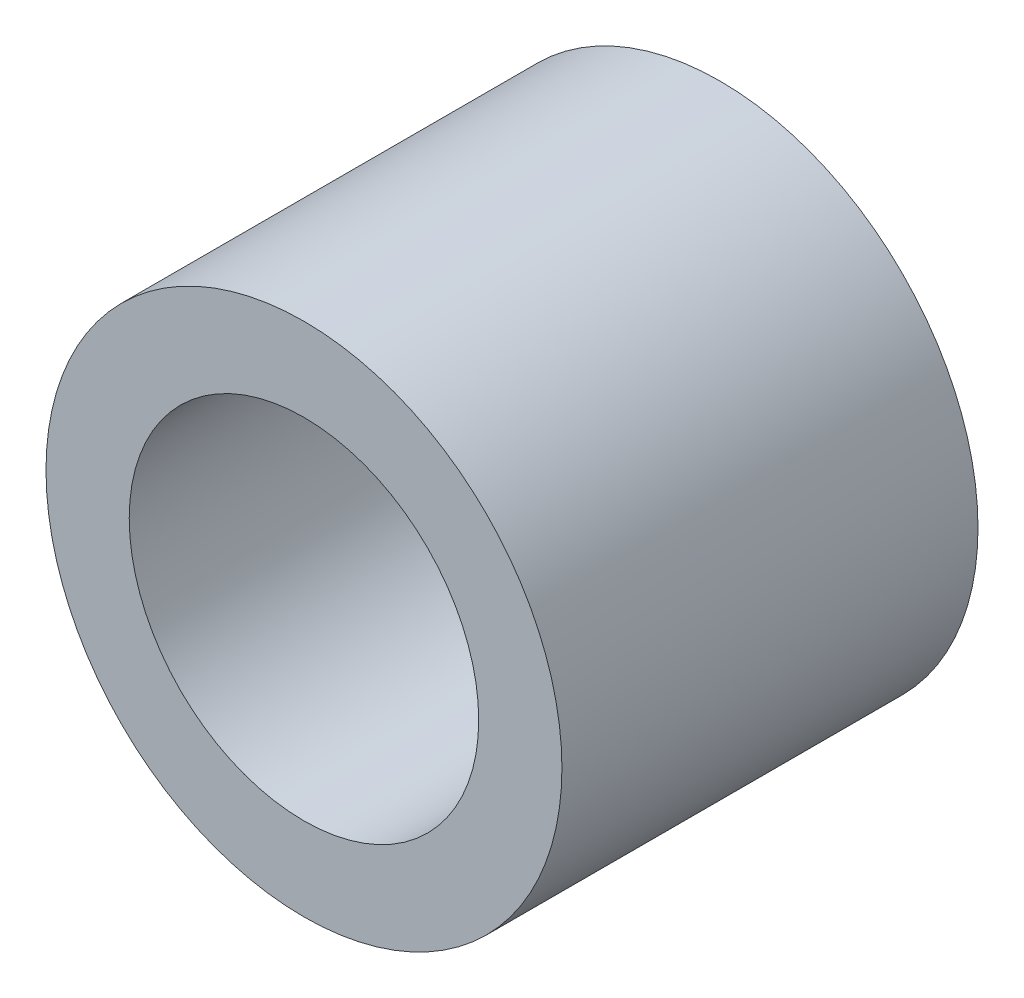
ISO-10303-21;
HEADER;
FILE_DESCRIPTION(('STEP AP214'),'2;1');
FILE_NAME('part.step','',(''),(''),'','','');
FILE_SCHEMA(('AUTOMOTIVE_DESIGN { 1 0 10303 214 1 1 1 1 }'));
ENDSEC;
DATA;
#1=APPLICATION_CONTEXT('core data for automotive mechanical design processes');
#2=APPLICATION_PROTOCOL_DEFINITION('international standard','automotive_design',2000,#1);
#3=PRODUCT_CONTEXT('',#1,'mechanical');
#4=PRODUCT('Part','Part','',(#3));
#5=PRODUCT_RELATED_PRODUCT_CATEGORY('part','',(#4));
#6=PRODUCT_DEFINITION_FORMATION('','',#4);
#7=PRODUCT_DEFINITION_CONTEXT('part definition',#1,'design');
#8=PRODUCT_DEFINITION('design','',#6,#7);
#9=PRODUCT_DEFINITION_SHAPE('','',#8);
#10=(LENGTH_UNIT() NAMED_UNIT(*) SI_UNIT(.MILLI.,.METRE.));
#11=(NAMED_UNIT(*) PLANE_ANGLE_UNIT() SI_UNIT($,.RADIAN.));
#12=(NAMED_UNIT(*) SI_UNIT($,.STERADIAN.) SOLID_ANGLE_UNIT());
#13=UNCERTAINTY_MEASURE_WITH_UNIT(LENGTH_MEASURE(1.E-05),#10,'distance_accuracy_value','');
#14=(GEOMETRIC_REPRESENTATION_CONTEXT(3) GLOBAL_UNCERTAINTY_ASSIGNED_CONTEXT((#13)) GLOBAL_UNIT_ASSIGNED_CONTEXT((#10,
#11,#12)) REPRESENTATION_CONTEXT('',''));
#15=CARTESIAN_POINT('',(0.,0.,0.));
#16=DIRECTION('',(0.,0.,1.));
#17=DIRECTION('',(1.,0.,0.));
#18=AXIS2_PLACEMENT_3D('',#15,#16,#17);
#19=CARTESIAN_POINT('',(0.,0.,2.5));
#20=DIRECTION('',(0.,0.,1.));
#21=DIRECTION('',(1.,0.,0.));
#22=AXIS2_PLACEMENT_3D('',#19,#20,#21);
#23=PLANE('',#22);
#24=CARTESIAN_POINT('',(0.,0.,2.5));
#25=DIRECTION('',(0.,0.,1.));
#26=DIRECTION('',(1.,0.,0.));
#27=AXIS2_PLACEMENT_3D('',#24,#25,#26);
#28=CIRCLE('',#27,3.1);
#29=CARTESIAN_POINT('',(3.1,0.,2.5));
#30=VERTEX_POINT('',#29);
#31=EDGE_CURVE('E10',#30,#30,#28,.T.);
#32=ORIENTED_EDGE('',*,*,#31,.T.);
#33=EDGE_LOOP('',(#32));
#34=FACE_BOUND('',#33,.T.);
#35=CARTESIAN_POINT('',(0.,0.,2.5));
#36=DIRECTION('',(0.,0.,1.));
#37=DIRECTION('',(1.,0.,0.));
#38=AXIS2_PLACEMENT_3D('',#35,#36,#37);
#39=CIRCLE('',#38,2.1);
#40=CARTESIAN_POINT('',(2.1,0.,2.5));
#41=VERTEX_POINT('',#40);
#42=EDGE_CURVE('E45',#41,#41,#39,.T.);
#43=ORIENTED_EDGE('',*,*,#42,.F.);
#44=EDGE_LOOP('',(#43));
#45=FACE_BOUND('',#44,.T.);
#46=ADVANCED_FACE('F34',(#34,#45),#23,.T.);
#47=CARTESIAN_POINT('',(0.,0.,-2.5));
#48=DIRECTION('',(0.,0.,1.));
#49=DIRECTION('',(1.,0.,0.));
#50=AXIS2_PLACEMENT_3D('',#47,#48,#49);
#51=PLANE('',#50);
#52=CARTESIAN_POINT('',(0.,0.,-2.5));
#53=DIRECTION('',(0.,0.,1.));
#54=DIRECTION('',(1.,0.,0.));
#55=AXIS2_PLACEMENT_3D('',#52,#53,#54);
#56=CIRCLE('',#55,3.1);
#57=CARTESIAN_POINT('',(3.1,0.,-2.5));
#58=VERTEX_POINT('',#57);
#59=EDGE_CURVE('E38',#58,#58,#56,.T.);
#60=ORIENTED_EDGE('',*,*,#59,.F.);
#61=EDGE_LOOP('',(#60));
#62=FACE_BOUND('',#61,.T.);
#63=CARTESIAN_POINT('',(0.,0.,-2.5));
#64=DIRECTION('',(0.,0.,1.));
#65=DIRECTION('',(1.,0.,0.));
#66=AXIS2_PLACEMENT_3D('',#63,#64,#65);
#67=CIRCLE('',#66,2.1);
#68=CARTESIAN_POINT('',(2.1,0.,-2.5));
#69=VERTEX_POINT('',#68);
#70=EDGE_CURVE('E47',#69,#69,#67,.T.);
#71=ORIENTED_EDGE('',*,*,#70,.T.);
#72=EDGE_LOOP('',(#71));
#73=FACE_BOUND('',#72,.T.);
#74=ADVANCED_FACE('F57',(#62,#73),#51,.F.);
#75=CARTESIAN_POINT('',(0.,0.,2.5));
#76=DIRECTION('',(0.,0.,-1.));
#77=DIRECTION('',(-1.,0.,0.));
#78=AXIS2_PLACEMENT_3D('',#75,#76,#77);
#79=CYLINDRICAL_SURFACE('',#78,3.1);
#80=ORIENTED_EDGE('',*,*,#31,.F.);
#81=EDGE_LOOP('',(#80));
#82=FACE_BOUND('',#81,.T.);
#83=ORIENTED_EDGE('',*,*,#59,.T.);
#84=EDGE_LOOP('',(#83));
#85=FACE_BOUND('',#84,.T.);
#86=ADVANCED_FACE('F36',(#82,#85),#79,.T.);
#87=CARTESIAN_POINT('',(0.,0.,2.5));
#88=DIRECTION('',(0.,0.,-1.));
#89=DIRECTION('',(-1.,0.,0.));
#90=AXIS2_PLACEMENT_3D('',#87,#88,#89);
#91=CYLINDRICAL_SURFACE('',#90,2.1);
#92=ORIENTED_EDGE('',*,*,#42,.T.);
#93=EDGE_LOOP('',(#92));
#94=FACE_BOUND('',#93,.T.);
#95=ORIENTED_EDGE('',*,*,#70,.F.);
#96=EDGE_LOOP('',(#95));
#97=FACE_BOUND('',#96,.T.);
#98=ADVANCED_FACE('F53',(#94,#97),#91,.F.);
#99=CLOSED_SHELL('',(#46,#74,#86,#98));
#100=MANIFOLD_SOLID_BREP('B2',#99);
#101=ADVANCED_BREP_SHAPE_REPRESENTATION('',(#18,#100),#14);
#102=SHAPE_DEFINITION_REPRESENTATION(#9,#101);
ENDSEC;
END-ISO-10303-21;
